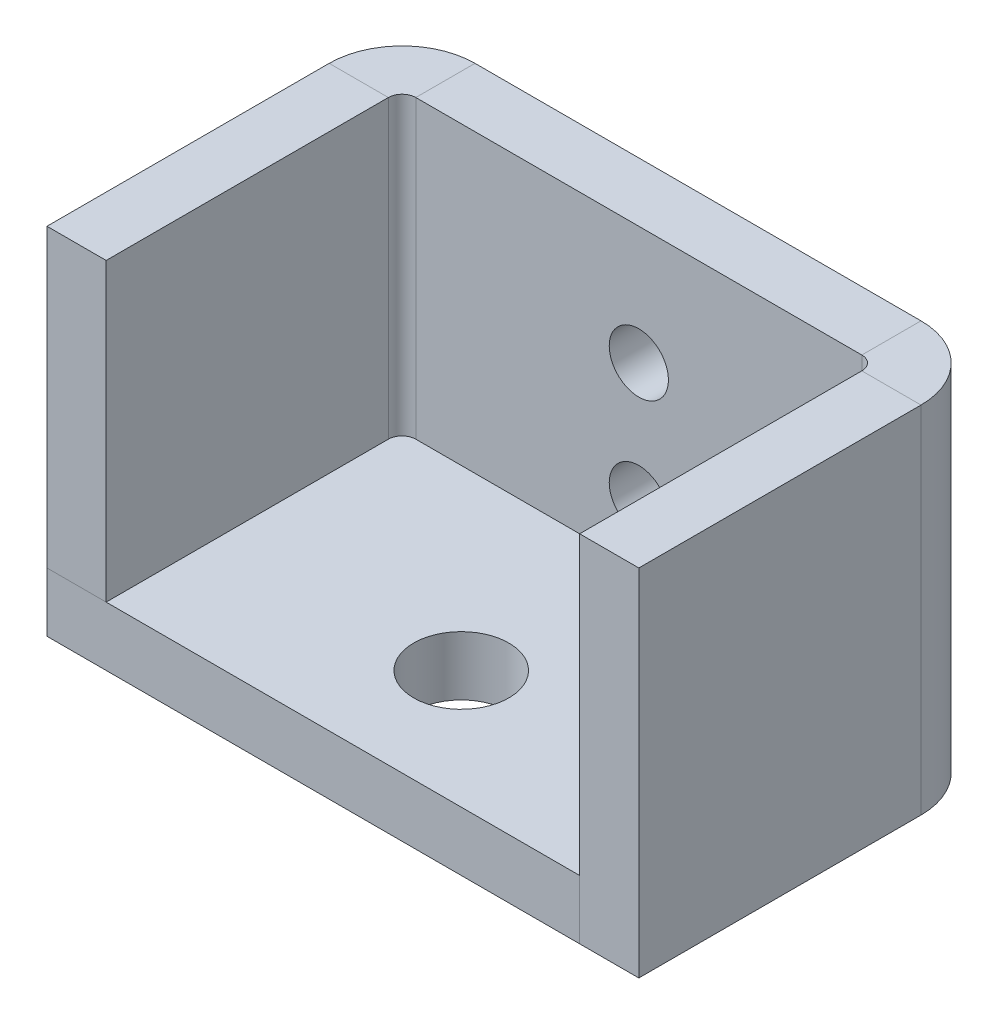
ISO-10303-21;
HEADER;
FILE_DESCRIPTION(('STEP AP214'),'2;1');
FILE_NAME('part.step','',(''),(''),'','','');
FILE_SCHEMA(('AUTOMOTIVE_DESIGN { 1 0 10303 214 1 1 1 1 }'));
ENDSEC;
DATA;
#1=APPLICATION_CONTEXT('core data for automotive mechanical design processes');
#2=APPLICATION_PROTOCOL_DEFINITION('international standard','automotive_design',2000,#1);
#3=PRODUCT_CONTEXT('',#1,'mechanical');
#4=PRODUCT('Part','Part','',(#3));
#5=PRODUCT_RELATED_PRODUCT_CATEGORY('part','',(#4));
#6=PRODUCT_DEFINITION_FORMATION('','',#4);
#7=PRODUCT_DEFINITION_CONTEXT('part definition',#1,'design');
#8=PRODUCT_DEFINITION('design','',#6,#7);
#9=PRODUCT_DEFINITION_SHAPE('','',#8);
#10=(LENGTH_UNIT() NAMED_UNIT(*) SI_UNIT(.MILLI.,.METRE.));
#11=(NAMED_UNIT(*) PLANE_ANGLE_UNIT() SI_UNIT($,.RADIAN.));
#12=(NAMED_UNIT(*) SI_UNIT($,.STERADIAN.) SOLID_ANGLE_UNIT());
#13=UNCERTAINTY_MEASURE_WITH_UNIT(LENGTH_MEASURE(1.E-05),#10,'distance_accuracy_value','');
#14=(GEOMETRIC_REPRESENTATION_CONTEXT(3) GLOBAL_UNCERTAINTY_ASSIGNED_CONTEXT((#13)) GLOBAL_UNIT_ASSIGNED_CONTEXT((#10,
#11,#12)) REPRESENTATION_CONTEXT('',''));
#15=CARTESIAN_POINT('',(0.,0.,0.));
#16=DIRECTION('',(0.,0.,1.));
#17=DIRECTION('',(1.,0.,0.));
#18=AXIS2_PLACEMENT_3D('',#15,#16,#17);
#19=CARTESIAN_POINT('',(-15.875,-6.35,15.875));
#20=DIRECTION('',(0.,0.,1.));
#21=DIRECTION('',(1.,0.,0.));
#22=AXIS2_PLACEMENT_3D('',#19,#20,#21);
#23=PLANE('',#22);
#24=DIRECTION('',(-1.,0.,0.));
#25=VECTOR('',#24,1.);
#26=CARTESIAN_POINT('',(-15.875,-9.525,15.875));
#27=LINE('',#26,#25);
#28=CARTESIAN_POINT('',(15.8750000000001,-9.525,15.875));
#29=VERTEX_POINT('',#28);
#30=CARTESIAN_POINT('',(-15.875,-9.525,15.875));
#31=VERTEX_POINT('',#30);
#32=EDGE_CURVE('E141',#29,#31,#27,.T.);
#33=ORIENTED_EDGE('',*,*,#32,.F.);
#34=DIRECTION('',(0.,-1.,0.));
#35=VECTOR('',#34,1.);
#36=CARTESIAN_POINT('',(15.8750000000001,-6.35,15.875));
#37=LINE('',#36,#35);
#38=CARTESIAN_POINT('',(15.8750000000001,-6.35,15.875));
#39=VERTEX_POINT('',#38);
#40=EDGE_CURVE('E12',#39,#29,#37,.T.);
#41=ORIENTED_EDGE('',*,*,#40,.F.);
#42=DIRECTION('',(-1.,0.,0.));
#43=VECTOR('',#42,1.);
#44=CARTESIAN_POINT('',(-15.875,-6.35,15.875));
#45=LINE('',#44,#43);
#46=CARTESIAN_POINT('',(-15.875,-6.35,15.875));
#47=VERTEX_POINT('',#46);
#48=EDGE_CURVE('E156',#39,#47,#45,.T.);
#49=ORIENTED_EDGE('',*,*,#48,.T.);
#50=DIRECTION('',(0.,-1.,0.));
#51=VECTOR('',#50,1.);
#52=CARTESIAN_POINT('',(-15.875,-6.35,15.875));
#53=LINE('',#52,#51);
#54=EDGE_CURVE('E59',#47,#31,#53,.T.);
#55=ORIENTED_EDGE('',*,*,#54,.T.);
#56=EDGE_LOOP('',(#33,#41,#49,#55));
#57=FACE_BOUND('',#56,.T.);
#58=ADVANCED_FACE('F56',(#57),#23,.T.);
#59=CARTESIAN_POINT('',(15.8750000000001,-6.35,15.875));
#60=DIRECTION('',(1.,0.,0.));
#61=DIRECTION('',(0.,0.,-1.));
#62=AXIS2_PLACEMENT_3D('',#59,#60,#61);
#63=PLANE('',#62);
#64=DIRECTION('',(0.,0.,1.));
#65=VECTOR('',#64,1.);
#66=CARTESIAN_POINT('',(15.8750000000001,-9.525,15.875));
#67=LINE('',#66,#65);
#68=CARTESIAN_POINT('',(15.875,-9.525,0.736599999999985));
#69=VERTEX_POINT('',#68);
#70=EDGE_CURVE('E154',#69,#29,#67,.T.);
#71=ORIENTED_EDGE('',*,*,#70,.F.);
#72=DIRECTION('',(0.,-1.,0.));
#73=VECTOR('',#72,1.);
#74=CARTESIAN_POINT('',(15.875,-6.35,0.736599999999985));
#75=LINE('',#74,#73);
#76=CARTESIAN_POINT('',(15.875,-6.35,0.736599999999985));
#77=VERTEX_POINT('',#76);
#78=EDGE_CURVE('E65',#77,#69,#75,.T.);
#79=ORIENTED_EDGE('',*,*,#78,.F.);
#80=DIRECTION('',(0.,0.,1.));
#81=VECTOR('',#80,1.);
#82=CARTESIAN_POINT('',(15.8750000000001,-6.35,15.875));
#83=LINE('',#82,#81);
#84=EDGE_CURVE('E131',#77,#39,#83,.T.);
#85=ORIENTED_EDGE('',*,*,#84,.T.);
#86=ORIENTED_EDGE('',*,*,#40,.T.);
#87=EDGE_LOOP('',(#71,#79,#85,#86));
#88=FACE_BOUND('',#87,.T.);
#89=ADVANCED_FACE('F164',(#88),#63,.T.);
#90=CARTESIAN_POINT('',(11.9634,-6.35,0.736599999999999));
#91=DIRECTION('',(0.,-1.,0.));
#92=DIRECTION('',(0.,0.,-1.));
#93=AXIS2_PLACEMENT_3D('',#90,#91,#92);
#94=CYLINDRICAL_SURFACE('',#93,3.9116);
#95=CARTESIAN_POINT('',(11.9634,-9.525,0.736599999999999));
#96=DIRECTION('',(0.,-1.,0.));
#97=DIRECTION('',(0.,0.,1.));
#98=AXIS2_PLACEMENT_3D('',#95,#96,#97);
#99=CIRCLE('',#98,3.9116);
#100=CARTESIAN_POINT('',(11.9634000000001,-9.525,-3.175));
#101=VERTEX_POINT('',#100);
#102=EDGE_CURVE('E118',#101,#69,#99,.T.);
#103=ORIENTED_EDGE('',*,*,#102,.F.);
#104=DIRECTION('',(0.,-1.,0.));
#105=VECTOR('',#104,1.);
#106=CARTESIAN_POINT('',(11.9634000000001,-6.35,-3.175));
#107=LINE('',#106,#105);
#108=CARTESIAN_POINT('',(11.9634000000001,-6.35,-3.175));
#109=VERTEX_POINT('',#108);
#110=EDGE_CURVE('E113',#109,#101,#107,.T.);
#111=ORIENTED_EDGE('',*,*,#110,.F.);
#112=CARTESIAN_POINT('',(11.9634,-6.35,0.736599999999999));
#113=DIRECTION('',(0.,-1.,0.));
#114=DIRECTION('',(0.,0.,1.));
#115=AXIS2_PLACEMENT_3D('',#112,#113,#114);
#116=CIRCLE('',#115,3.9116);
#117=EDGE_CURVE('E116',#109,#77,#116,.T.);
#118=ORIENTED_EDGE('',*,*,#117,.T.);
#119=ORIENTED_EDGE('',*,*,#78,.T.);
#120=EDGE_LOOP('',(#103,#111,#118,#119));
#121=FACE_BOUND('',#120,.T.);
#122=ADVANCED_FACE('F115',(#121),#94,.T.);
#123=CARTESIAN_POINT('',(-11.9634,-6.35,-3.17500000000001));
#124=DIRECTION('',(0.,0.,-1.));
#125=DIRECTION('',(-1.,0.,0.));
#126=AXIS2_PLACEMENT_3D('',#123,#124,#125);
#127=PLANE('',#126);
#128=DIRECTION('',(1.,0.,0.));
#129=VECTOR('',#128,1.);
#130=CARTESIAN_POINT('',(-11.9634,-9.525,-3.17500000000001));
#131=LINE('',#130,#129);
#132=CARTESIAN_POINT('',(-11.9634,-9.525,-3.17500000000001));
#133=VERTEX_POINT('',#132);
#134=EDGE_CURVE('E151',#133,#101,#131,.T.);
#135=ORIENTED_EDGE('',*,*,#134,.F.);
#136=DIRECTION('',(0.,-1.,0.));
#137=VECTOR('',#136,1.);
#138=CARTESIAN_POINT('',(-11.9634,-6.35,-3.17500000000001));
#139=LINE('',#138,#137);
#140=CARTESIAN_POINT('',(-11.9634,-6.35,-3.17500000000001));
#141=VERTEX_POINT('',#140);
#142=EDGE_CURVE('E123',#141,#133,#139,.T.);
#143=ORIENTED_EDGE('',*,*,#142,.F.);
#144=DIRECTION('',(1.,0.,0.));
#145=VECTOR('',#144,1.);
#146=CARTESIAN_POINT('',(-11.9634,-6.35,-3.17500000000001));
#147=LINE('',#146,#145);
#148=EDGE_CURVE('E129',#141,#109,#147,.T.);
#149=ORIENTED_EDGE('',*,*,#148,.T.);
#150=ORIENTED_EDGE('',*,*,#110,.T.);
#151=EDGE_LOOP('',(#135,#143,#149,#150));
#152=FACE_BOUND('',#151,.T.);
#153=ADVANCED_FACE('F133',(#152),#127,.T.);
#154=CARTESIAN_POINT('',(-11.9634,-6.35,0.736599999999982));
#155=DIRECTION('',(0.,-1.,0.));
#156=DIRECTION('',(0.,0.,-1.));
#157=AXIS2_PLACEMENT_3D('',#154,#155,#156);
#158=CYLINDRICAL_SURFACE('',#157,3.91159999999999);
#159=CARTESIAN_POINT('',(-11.9634,-9.525,0.736599999999982));
#160=DIRECTION('',(0.,-1.,0.));
#161=DIRECTION('',(0.,0.,-1.));
#162=AXIS2_PLACEMENT_3D('',#159,#160,#161);
#163=CIRCLE('',#162,3.91159999999999);
#164=CARTESIAN_POINT('',(-15.875,-9.525,0.736599999999972));
#165=VERTEX_POINT('',#164);
#166=EDGE_CURVE('E148',#165,#133,#163,.T.);
#167=ORIENTED_EDGE('',*,*,#166,.F.);
#168=DIRECTION('',(0.,-1.,0.));
#169=VECTOR('',#168,1.);
#170=CARTESIAN_POINT('',(-15.875,-6.35,0.736599999999972));
#171=LINE('',#170,#169);
#172=CARTESIAN_POINT('',(-15.875,-6.35,0.736599999999972));
#173=VERTEX_POINT('',#172);
#174=EDGE_CURVE('E159',#173,#165,#171,.T.);
#175=ORIENTED_EDGE('',*,*,#174,.F.);
#176=CARTESIAN_POINT('',(-11.9634,-6.35,0.736599999999982));
#177=DIRECTION('',(0.,-1.,0.));
#178=DIRECTION('',(0.,0.,-1.));
#179=AXIS2_PLACEMENT_3D('',#176,#177,#178);
#180=CIRCLE('',#179,3.91159999999999);
#181=EDGE_CURVE('E134',#173,#141,#180,.T.);
#182=ORIENTED_EDGE('',*,*,#181,.T.);
#183=ORIENTED_EDGE('',*,*,#142,.T.);
#184=EDGE_LOOP('',(#167,#175,#182,#183));
#185=FACE_BOUND('',#184,.T.);
#186=ADVANCED_FACE('F177',(#185),#158,.T.);
#187=CARTESIAN_POINT('',(-15.875,-6.35,15.875));
#188=DIRECTION('',(-1.,0.,0.));
#189=DIRECTION('',(0.,0.,1.));
#190=AXIS2_PLACEMENT_3D('',#187,#188,#189);
#191=PLANE('',#190);
#192=DIRECTION('',(0.,0.,-1.));
#193=VECTOR('',#192,1.);
#194=CARTESIAN_POINT('',(-15.875,-9.525,15.875));
#195=LINE('',#194,#193);
#196=EDGE_CURVE('E144',#31,#165,#195,.T.);
#197=ORIENTED_EDGE('',*,*,#196,.F.);
#198=ORIENTED_EDGE('',*,*,#54,.F.);
#199=DIRECTION('',(0.,0.,-1.));
#200=VECTOR('',#199,1.);
#201=CARTESIAN_POINT('',(-15.875,-6.35,15.875));
#202=LINE('',#201,#200);
#203=EDGE_CURVE('E136',#47,#173,#202,.T.);
#204=ORIENTED_EDGE('',*,*,#203,.T.);
#205=ORIENTED_EDGE('',*,*,#174,.T.);
#206=EDGE_LOOP('',(#197,#198,#204,#205));
#207=FACE_BOUND('',#206,.T.);
#208=ADVANCED_FACE('F161',(#207),#191,.T.);
#209=CARTESIAN_POINT('',(11.9634,-6.35,0.736599999999999));
#210=DIRECTION('',(0.,1.,0.));
#211=DIRECTION('',(0.,0.,1.));
#212=AXIS2_PLACEMENT_3D('',#209,#210,#211);
#213=PLANE('',#212);
#214=CARTESIAN_POINT('',(0.,-6.35,9.525));
#215=DIRECTION('',(0.,1.,0.));
#216=DIRECTION('',(0.,0.,1.));
#217=AXIS2_PLACEMENT_3D('',#214,#215,#216);
#218=CIRCLE('',#217,2.5527);
#219=CARTESIAN_POINT('',(0.,-6.35,12.0777));
#220=VERTEX_POINT('',#219);
#221=EDGE_CURVE('E200',#220,#220,#218,.T.);
#222=ORIENTED_EDGE('',*,*,#221,.F.);
#223=EDGE_LOOP('',(#222));
#224=FACE_BOUND('',#223,.T.);
#225=ORIENTED_EDGE('',*,*,#48,.F.);
#226=ORIENTED_EDGE('',*,*,#84,.F.);
#227=ORIENTED_EDGE('',*,*,#117,.F.);
#228=ORIENTED_EDGE('',*,*,#148,.F.);
#229=ORIENTED_EDGE('',*,*,#181,.F.);
#230=ORIENTED_EDGE('',*,*,#203,.F.);
#231=EDGE_LOOP('',(#225,#226,#227,#228,#229,#230));
#232=FACE_BOUND('',#231,.T.);
#233=ADVANCED_FACE('F127',(#224,#232),#213,.T.);
#234=CARTESIAN_POINT('',(11.9634,-9.525,0.736599999999999));
#235=DIRECTION('',(0.,1.,0.));
#236=DIRECTION('',(0.,0.,1.));
#237=AXIS2_PLACEMENT_3D('',#234,#235,#236);
#238=PLANE('',#237);
#239=CARTESIAN_POINT('',(0.,-9.52499999999999,9.525));
#240=DIRECTION('',(0.,1.,0.));
#241=DIRECTION('',(0.,0.,1.));
#242=AXIS2_PLACEMENT_3D('',#239,#240,#241);
#243=CIRCLE('',#242,2.5527);
#244=CARTESIAN_POINT('',(0.,-9.52499999999999,12.0777));
#245=VERTEX_POINT('',#244);
#246=EDGE_CURVE('E145',#245,#245,#243,.T.);
#247=ORIENTED_EDGE('',*,*,#246,.T.);
#248=EDGE_LOOP('',(#247));
#249=FACE_BOUND('',#248,.T.);
#250=ORIENTED_EDGE('',*,*,#32,.T.);
#251=ORIENTED_EDGE('',*,*,#196,.T.);
#252=ORIENTED_EDGE('',*,*,#166,.T.);
#253=ORIENTED_EDGE('',*,*,#134,.T.);
#254=ORIENTED_EDGE('',*,*,#102,.T.);
#255=ORIENTED_EDGE('',*,*,#70,.T.);
#256=EDGE_LOOP('',(#250,#251,#252,#253,#254,#255));
#257=FACE_BOUND('',#256,.T.);
#258=ADVANCED_FACE('F163',(#249,#257),#238,.F.);
#259=CARTESIAN_POINT('',(0.,-6.35,9.525));
#260=DIRECTION('',(0.,1.,0.));
#261=DIRECTION('',(0.,0.,1.));
#262=AXIS2_PLACEMENT_3D('',#259,#260,#261);
#263=CYLINDRICAL_SURFACE('',#262,2.5527);
#264=ORIENTED_EDGE('',*,*,#246,.F.);
#265=EDGE_LOOP('',(#264));
#266=FACE_BOUND('',#265,.T.);
#267=ORIENTED_EDGE('',*,*,#221,.T.);
#268=EDGE_LOOP('',(#267));
#269=FACE_BOUND('',#268,.T.);
#270=ADVANCED_FACE('F188',(#266,#269),#263,.F.);
#271=CLOSED_SHELL('',(#58,#89,#122,#153,#186,#208,#233,#258,#270));
#272=MANIFOLD_SOLID_BREP('B2',#271);
#273=CARTESIAN_POINT('',(-12.7,-9.525,-3.175));
#274=DIRECTION('',(0.,-1.,0.));
#275=DIRECTION('',(0.,0.,-1.));
#276=AXIS2_PLACEMENT_3D('',#273,#274,#275);
#277=PLANE('',#276);
#278=DIRECTION('',(0.,0.,-1.));
#279=VECTOR('',#278,1.);
#280=CARTESIAN_POINT('',(-1.5875,-9.525,15.875));
#281=LINE('',#280,#279);
#282=CARTESIAN_POINT('',(-1.5875,-9.525,0.));
#283=VERTEX_POINT('',#282);
#284=CARTESIAN_POINT('',(-1.5875,-9.525,-3.175));
#285=VERTEX_POINT('',#284);
#286=EDGE_CURVE('E54',#283,#285,#281,.T.);
#287=ORIENTED_EDGE('',*,*,#286,.F.);
#288=DIRECTION('',(1.,0.,0.));
#289=VECTOR('',#288,1.);
#290=CARTESIAN_POINT('',(-12.7,-9.525,0.));
#291=LINE('',#290,#289);
#292=CARTESIAN_POINT('',(-11.9634,-9.525,0.));
#293=VERTEX_POINT('',#292);
#294=EDGE_CURVE('E404',#293,#283,#291,.T.);
#295=ORIENTED_EDGE('',*,*,#294,.F.);
#296=DIRECTION('',(0.,0.,-1.));
#297=VECTOR('',#296,1.);
#298=CARTESIAN_POINT('',(-11.9634,-9.525,0.));
#299=LINE('',#298,#297);
#300=CARTESIAN_POINT('',(-11.9634,-9.525,-3.175));
#301=VERTEX_POINT('',#300);
#302=EDGE_CURVE('E388',#293,#301,#299,.T.);
#303=ORIENTED_EDGE('',*,*,#302,.T.);
#304=DIRECTION('',(1.,0.,0.));
#305=VECTOR('',#304,1.);
#306=CARTESIAN_POINT('',(-12.7,-9.525,-3.175));
#307=LINE('',#306,#305);
#308=EDGE_CURVE('E380',#301,#285,#307,.T.);
#309=ORIENTED_EDGE('',*,*,#308,.T.);
#310=EDGE_LOOP('',(#287,#295,#303,#309));
#311=FACE_BOUND('',#310,.T.);
#312=ADVANCED_FACE('F268',(#311),#277,.T.);
#313=CARTESIAN_POINT('',(0.,0.,-3.175));
#314=DIRECTION('',(0.,0.,1.));
#315=DIRECTION('',(1.,0.,0.));
#316=AXIS2_PLACEMENT_3D('',#313,#314,#315);
#317=PLANE('',#316);
#318=CARTESIAN_POINT('',(0.,3.17500000000002,-3.175));
#319=DIRECTION('',(0.,0.,-1.));
#320=DIRECTION('',(-1.,0.,0.));
#321=AXIS2_PLACEMENT_3D('',#318,#319,#320);
#322=CIRCLE('',#321,1.5875);
#323=CARTESIAN_POINT('',(-1.5875,3.17500000000002,-3.175));
#324=VERTEX_POINT('',#323);
#325=EDGE_CURVE('E415',#324,#324,#322,.T.);
#326=ORIENTED_EDGE('',*,*,#325,.F.);
#327=EDGE_LOOP('',(#326));
#328=FACE_BOUND('',#327,.T.);
#329=CARTESIAN_POINT('',(0.,-3.17500000000001,-3.175));
#330=DIRECTION('',(0.,0.,-1.));
#331=DIRECTION('',(-1.,0.,0.));
#332=AXIS2_PLACEMENT_3D('',#329,#330,#331);
#333=CIRCLE('',#332,1.5875);
#334=CARTESIAN_POINT('',(-1.5875,-3.17500000000001,-3.175));
#335=VERTEX_POINT('',#334);
#336=EDGE_CURVE('E385',#335,#335,#333,.T.);
#337=ORIENTED_EDGE('',*,*,#336,.F.);
#338=EDGE_LOOP('',(#337));
#339=FACE_BOUND('',#338,.T.);
#340=CARTESIAN_POINT('',(1.5875,-9.525,-3.175));
#341=VERTEX_POINT('',#340);
#342=CARTESIAN_POINT('',(11.9634,-9.52499999999997,-3.175));
#343=VERTEX_POINT('',#342);
#344=EDGE_CURVE('E383',#341,#343,#307,.T.);
#345=ORIENTED_EDGE('',*,*,#344,.F.);
#346=CARTESIAN_POINT('',(0.,-9.52500000000004,-3.175));
#347=DIRECTION('',(0.,0.,-1.));
#348=DIRECTION('',(-1.,0.,0.));
#349=AXIS2_PLACEMENT_3D('',#346,#347,#348);
#350=CIRCLE('',#349,1.5875);
#351=EDGE_CURVE('E285',#285,#341,#350,.T.);
#352=ORIENTED_EDGE('',*,*,#351,.F.);
#353=ORIENTED_EDGE('',*,*,#308,.F.);
#354=DIRECTION('',(0.,-1.,0.));
#355=VECTOR('',#354,1.);
#356=CARTESIAN_POINT('',(-11.9634,-9.525,-3.175));
#357=LINE('',#356,#355);
#358=CARTESIAN_POINT('',(-11.9634,9.52500000000002,-3.175));
#359=VERTEX_POINT('',#358);
#360=EDGE_CURVE('E464',#301,#359,#357,.F.);
#361=ORIENTED_EDGE('',*,*,#360,.T.);
#362=DIRECTION('',(-1.,0.,0.));
#363=VECTOR('',#362,1.);
#364=CARTESIAN_POINT('',(12.7,9.525,-3.175));
#365=LINE('',#364,#363);
#366=CARTESIAN_POINT('',(11.9634,9.525,-3.175));
#367=VERTEX_POINT('',#366);
#368=EDGE_CURVE('E395',#367,#359,#365,.T.);
#369=ORIENTED_EDGE('',*,*,#368,.F.);
#370=DIRECTION('',(0.,1.,0.));
#371=VECTOR('',#370,1.);
#372=CARTESIAN_POINT('',(11.9634,9.525,-3.175));
#373=LINE('',#372,#371);
#374=EDGE_CURVE('E535',#367,#343,#373,.F.);
#375=ORIENTED_EDGE('',*,*,#374,.T.);
#376=EDGE_LOOP('',(#345,#352,#353,#361,#369,#375));
#377=FACE_BOUND('',#376,.T.);
#378=ADVANCED_FACE('F379',(#328,#339,#377),#317,.F.);
#379=CARTESIAN_POINT('',(0.,0.,0.));
#380=DIRECTION('',(0.,0.,1.));
#381=DIRECTION('',(1.,0.,0.));
#382=AXIS2_PLACEMENT_3D('',#379,#380,#381);
#383=PLANE('',#382);
#384=CARTESIAN_POINT('',(0.,3.17500000000002,0.));
#385=DIRECTION('',(0.,0.,1.));
#386=DIRECTION('',(1.,0.,0.));
#387=AXIS2_PLACEMENT_3D('',#384,#385,#386);
#388=CIRCLE('',#387,1.5875);
#389=CARTESIAN_POINT('',(1.58749999999999,3.17500000000002,0.));
#390=VERTEX_POINT('',#389);
#391=EDGE_CURVE('E272',#390,#390,#388,.T.);
#392=ORIENTED_EDGE('',*,*,#391,.F.);
#393=EDGE_LOOP('',(#392));
#394=FACE_BOUND('',#393,.T.);
#395=CARTESIAN_POINT('',(0.,-3.17500000000001,0.));
#396=DIRECTION('',(0.,0.,1.));
#397=DIRECTION('',(1.,0.,0.));
#398=AXIS2_PLACEMENT_3D('',#395,#396,#397);
#399=CIRCLE('',#398,1.5875);
#400=CARTESIAN_POINT('',(1.5875,-3.17500000000001,0.));
#401=VERTEX_POINT('',#400);
#402=EDGE_CURVE('E406',#401,#401,#399,.T.);
#403=ORIENTED_EDGE('',*,*,#402,.F.);
#404=EDGE_LOOP('',(#403));
#405=FACE_BOUND('',#404,.T.);
#406=CARTESIAN_POINT('',(0.,-9.52500000000004,0.));
#407=DIRECTION('',(0.,0.,1.));
#408=DIRECTION('',(1.,0.,0.));
#409=AXIS2_PLACEMENT_3D('',#406,#407,#408);
#410=CIRCLE('',#409,1.5875);
#411=CARTESIAN_POINT('',(1.58749999999999,-9.525,0.));
#412=VERTEX_POINT('',#411);
#413=EDGE_CURVE('E372',#412,#283,#410,.T.);
#414=ORIENTED_EDGE('',*,*,#413,.F.);
#415=CARTESIAN_POINT('',(11.9634,-9.525,0.));
#416=VERTEX_POINT('',#415);
#417=EDGE_CURVE('E402',#412,#416,#291,.T.);
#418=ORIENTED_EDGE('',*,*,#417,.T.);
#419=DIRECTION('',(0.,1.,0.));
#420=VECTOR('',#419,1.);
#421=CARTESIAN_POINT('',(11.9634,9.525,0.));
#422=LINE('',#421,#420);
#423=CARTESIAN_POINT('',(11.9634,9.525,0.));
#424=VERTEX_POINT('',#423);
#425=EDGE_CURVE('E293',#424,#416,#422,.F.);
#426=ORIENTED_EDGE('',*,*,#425,.F.);
#427=DIRECTION('',(-1.,0.,0.));
#428=VECTOR('',#427,1.);
#429=CARTESIAN_POINT('',(12.7,9.525,0.));
#430=LINE('',#429,#428);
#431=CARTESIAN_POINT('',(-11.9634,9.525,0.));
#432=VERTEX_POINT('',#431);
#433=EDGE_CURVE('E399',#424,#432,#430,.T.);
#434=ORIENTED_EDGE('',*,*,#433,.T.);
#435=DIRECTION('',(0.,-1.,0.));
#436=VECTOR('',#435,1.);
#437=CARTESIAN_POINT('',(-11.9634,-9.525,0.));
#438=LINE('',#437,#436);
#439=EDGE_CURVE('E479',#293,#432,#438,.F.);
#440=ORIENTED_EDGE('',*,*,#439,.F.);
#441=ORIENTED_EDGE('',*,*,#294,.T.);
#442=EDGE_LOOP('',(#414,#418,#426,#434,#440,#441));
#443=FACE_BOUND('',#442,.T.);
#444=ADVANCED_FACE('F612',(#394,#405,#443),#383,.T.);
#445=DIRECTION('',(0.,0.,-1.));
#446=VECTOR('',#445,1.);
#447=CARTESIAN_POINT('',(1.58749999999999,-9.525,15.875));
#448=LINE('',#447,#446);
#449=EDGE_CURVE('E278',#341,#412,#448,.F.);
#450=ORIENTED_EDGE('',*,*,#449,.F.);
#451=ORIENTED_EDGE('',*,*,#344,.T.);
#452=DIRECTION('',(0.,0.,-1.));
#453=VECTOR('',#452,1.);
#454=CARTESIAN_POINT('',(11.9634,-9.525,0.));
#455=LINE('',#454,#453);
#456=EDGE_CURVE('E403',#416,#343,#455,.T.);
#457=ORIENTED_EDGE('',*,*,#456,.F.);
#458=ORIENTED_EDGE('',*,*,#417,.F.);
#459=EDGE_LOOP('',(#450,#451,#457,#458));
#460=FACE_BOUND('',#459,.T.);
#461=ADVANCED_FACE('F607',(#460),#277,.T.);
#462=CARTESIAN_POINT('',(12.7,9.525,-3.175));
#463=DIRECTION('',(0.,1.,0.));
#464=DIRECTION('',(-1.,0.,0.));
#465=AXIS2_PLACEMENT_3D('',#462,#463,#464);
#466=PLANE('',#465);
#467=DIRECTION('',(0.,0.,-1.));
#468=VECTOR('',#467,1.);
#469=CARTESIAN_POINT('',(-11.9634,9.525,0.));
#470=LINE('',#469,#468);
#471=EDGE_CURVE('E486',#432,#359,#470,.T.);
#472=ORIENTED_EDGE('',*,*,#471,.F.);
#473=ORIENTED_EDGE('',*,*,#433,.F.);
#474=DIRECTION('',(0.,0.,-1.));
#475=VECTOR('',#474,1.);
#476=CARTESIAN_POINT('',(11.9634,9.525,0.));
#477=LINE('',#476,#475);
#478=EDGE_CURVE('E543',#424,#367,#477,.T.);
#479=ORIENTED_EDGE('',*,*,#478,.T.);
#480=ORIENTED_EDGE('',*,*,#368,.T.);
#481=EDGE_LOOP('',(#472,#473,#479,#480));
#482=FACE_BOUND('',#481,.T.);
#483=ADVANCED_FACE('F270',(#482),#466,.T.);
#484=CARTESIAN_POINT('',(11.9634,-9.525,0.7366));
#485=DIRECTION('',(0.,-1.,0.));
#486=DIRECTION('',(0.,0.,-1.));
#487=AXIS2_PLACEMENT_3D('',#484,#485,#486);
#488=PLANE('',#487);
#489=DIRECTION('',(1.,0.,0.));
#490=VECTOR('',#489,1.);
#491=CARTESIAN_POINT('',(12.7,-9.525,0.736599999999997));
#492=LINE('',#491,#490);
#493=CARTESIAN_POINT('',(12.7,-9.525,0.736599999999997));
#494=VERTEX_POINT('',#493);
#495=CARTESIAN_POINT('',(15.875,-9.525,0.736599999999986));
#496=VERTEX_POINT('',#495);
#497=EDGE_CURVE('E490',#494,#496,#492,.T.);
#498=ORIENTED_EDGE('',*,*,#497,.F.);
#499=CARTESIAN_POINT('',(11.9634,-9.525,0.7366));
#500=DIRECTION('',(0.,1.,0.));
#501=DIRECTION('',(0.,0.,1.));
#502=AXIS2_PLACEMENT_3D('',#499,#500,#501);
#503=CIRCLE('',#502,0.736599999999999);
#504=EDGE_CURVE('E547',#416,#494,#503,.F.);
#505=ORIENTED_EDGE('',*,*,#504,.F.);
#506=ORIENTED_EDGE('',*,*,#456,.T.);
#507=CARTESIAN_POINT('',(11.9634,-9.525,0.7366));
#508=DIRECTION('',(0.,1.,0.));
#509=DIRECTION('',(0.,0.,1.));
#510=AXIS2_PLACEMENT_3D('',#507,#508,#509);
#511=CIRCLE('',#510,3.9116);
#512=EDGE_CURVE('E538',#343,#496,#511,.F.);
#513=ORIENTED_EDGE('',*,*,#512,.T.);
#514=EDGE_LOOP('',(#498,#505,#506,#513));
#515=FACE_BOUND('',#514,.T.);
#516=ADVANCED_FACE('F590',(#515),#488,.T.);
#517=CARTESIAN_POINT('',(11.9634,9.525,0.7366));
#518=DIRECTION('',(0.,-1.,0.));
#519=DIRECTION('',(0.,0.,-1.));
#520=AXIS2_PLACEMENT_3D('',#517,#518,#519);
#521=PLANE('',#520);
#522=CARTESIAN_POINT('',(11.9634,9.525,0.7366));
#523=DIRECTION('',(0.,1.,0.));
#524=DIRECTION('',(0.,0.,1.));
#525=AXIS2_PLACEMENT_3D('',#522,#523,#524);
#526=CIRCLE('',#525,0.736599999999999);
#527=CARTESIAN_POINT('',(12.7,9.525,0.736599999999997));
#528=VERTEX_POINT('',#527);
#529=EDGE_CURVE('E534',#528,#424,#526,.T.);
#530=ORIENTED_EDGE('',*,*,#529,.F.);
#531=DIRECTION('',(1.,0.,0.));
#532=VECTOR('',#531,1.);
#533=CARTESIAN_POINT('',(12.7,9.525,0.736599999999997));
#534=LINE('',#533,#532);
#535=CARTESIAN_POINT('',(15.875,9.525,0.736599999999986));
#536=VERTEX_POINT('',#535);
#537=EDGE_CURVE('E496',#528,#536,#534,.T.);
#538=ORIENTED_EDGE('',*,*,#537,.T.);
#539=CARTESIAN_POINT('',(11.9634,9.525,0.7366));
#540=DIRECTION('',(0.,1.,0.));
#541=DIRECTION('',(0.,0.,1.));
#542=AXIS2_PLACEMENT_3D('',#539,#540,#541);
#543=CIRCLE('',#542,3.9116);
#544=EDGE_CURVE('E539',#536,#367,#543,.T.);
#545=ORIENTED_EDGE('',*,*,#544,.T.);
#546=ORIENTED_EDGE('',*,*,#478,.F.);
#547=EDGE_LOOP('',(#530,#538,#545,#546));
#548=FACE_BOUND('',#547,.T.);
#549=ADVANCED_FACE('F569',(#548),#521,.F.);
#550=CARTESIAN_POINT('',(11.9634,9.525,0.7366));
#551=DIRECTION('',(0.,1.,0.));
#552=DIRECTION('',(1.,0.,0.));
#553=AXIS2_PLACEMENT_3D('',#550,#551,#552);
#554=CYLINDRICAL_SURFACE('',#553,3.9116);
#555=ORIENTED_EDGE('',*,*,#374,.F.);
#556=ORIENTED_EDGE('',*,*,#544,.F.);
#557=DIRECTION('',(0.,-1.,0.));
#558=VECTOR('',#557,1.);
#559=CARTESIAN_POINT('',(15.875,0.,0.736599999999986));
#560=LINE('',#559,#558);
#561=EDGE_CURVE('E500',#536,#496,#560,.T.);
#562=ORIENTED_EDGE('',*,*,#561,.T.);
#563=ORIENTED_EDGE('',*,*,#512,.F.);
#564=EDGE_LOOP('',(#555,#556,#562,#563));
#565=FACE_BOUND('',#564,.T.);
#566=ADVANCED_FACE('F568',(#565),#554,.T.);
#567=CARTESIAN_POINT('',(11.9634,9.525,0.7366));
#568=DIRECTION('',(0.,1.,0.));
#569=DIRECTION('',(1.,0.,0.));
#570=AXIS2_PLACEMENT_3D('',#567,#568,#569);
#571=CYLINDRICAL_SURFACE('',#570,0.736599999999999);
#572=ORIENTED_EDGE('',*,*,#425,.T.);
#573=ORIENTED_EDGE('',*,*,#504,.T.);
#574=DIRECTION('',(0.,1.,0.));
#575=VECTOR('',#574,1.);
#576=CARTESIAN_POINT('',(12.7,-9.525,0.736599999999997));
#577=LINE('',#576,#575);
#578=EDGE_CURVE('E493',#494,#528,#577,.T.);
#579=ORIENTED_EDGE('',*,*,#578,.T.);
#580=ORIENTED_EDGE('',*,*,#529,.T.);
#581=EDGE_LOOP('',(#572,#573,#579,#580));
#582=FACE_BOUND('',#581,.T.);
#583=ADVANCED_FACE('F593',(#582),#571,.F.);
#584=CARTESIAN_POINT('',(15.8750000000001,9.525,15.875));
#585=DIRECTION('',(0.,-1.,0.));
#586=DIRECTION('',(0.,0.,-1.));
#587=AXIS2_PLACEMENT_3D('',#584,#585,#586);
#588=PLANE('',#587);
#589=ORIENTED_EDGE('',*,*,#537,.F.);
#590=DIRECTION('',(0.,0.,1.));
#591=VECTOR('',#590,1.);
#592=CARTESIAN_POINT('',(12.7000000000001,9.525,15.875));
#593=LINE('',#592,#591);
#594=CARTESIAN_POINT('',(12.7000000000001,9.525,15.875));
#595=VERTEX_POINT('',#594);
#596=EDGE_CURVE('E506',#528,#595,#593,.T.);
#597=ORIENTED_EDGE('',*,*,#596,.T.);
#598=DIRECTION('',(-1.,0.,0.));
#599=VECTOR('',#598,1.);
#600=CARTESIAN_POINT('',(15.8750000000001,9.525,15.875));
#601=LINE('',#600,#599);
#602=CARTESIAN_POINT('',(15.8750000000001,9.525,15.875));
#603=VERTEX_POINT('',#602);
#604=EDGE_CURVE('E530',#603,#595,#601,.T.);
#605=ORIENTED_EDGE('',*,*,#604,.F.);
#606=DIRECTION('',(0.,0.,1.));
#607=VECTOR('',#606,1.);
#608=CARTESIAN_POINT('',(15.8750000000001,9.525,15.875));
#609=LINE('',#608,#607);
#610=EDGE_CURVE('E507',#536,#603,#609,.T.);
#611=ORIENTED_EDGE('',*,*,#610,.F.);
#612=EDGE_LOOP('',(#589,#597,#605,#611));
#613=FACE_BOUND('',#612,.T.);
#614=ADVANCED_FACE('F579',(#613),#588,.F.);
#615=CARTESIAN_POINT('',(15.875,-9.525,0.));
#616=DIRECTION('',(0.,1.,0.));
#617=DIRECTION('',(0.,0.,1.));
#618=AXIS2_PLACEMENT_3D('',#615,#616,#617);
#619=PLANE('',#618);
#620=ORIENTED_EDGE('',*,*,#497,.T.);
#621=DIRECTION('',(0.,0.,-1.));
#622=VECTOR('',#621,1.);
#623=CARTESIAN_POINT('',(15.875,-9.525,0.));
#624=LINE('',#623,#622);
#625=CARTESIAN_POINT('',(15.8750000000001,-9.525,15.875));
#626=VERTEX_POINT('',#625);
#627=EDGE_CURVE('E514',#626,#496,#624,.T.);
#628=ORIENTED_EDGE('',*,*,#627,.F.);
#629=DIRECTION('',(-1.,0.,0.));
#630=VECTOR('',#629,1.);
#631=CARTESIAN_POINT('',(15.8750000000001,-9.525,15.875));
#632=LINE('',#631,#630);
#633=CARTESIAN_POINT('',(12.7000000000001,-9.525,15.875));
#634=VERTEX_POINT('',#633);
#635=EDGE_CURVE('E518',#626,#634,#632,.T.);
#636=ORIENTED_EDGE('',*,*,#635,.T.);
#637=DIRECTION('',(0.,0.,-1.));
#638=VECTOR('',#637,1.);
#639=CARTESIAN_POINT('',(12.7,-9.525,0.));
#640=LINE('',#639,#638);
#641=EDGE_CURVE('E511',#634,#494,#640,.T.);
#642=ORIENTED_EDGE('',*,*,#641,.T.);
#643=EDGE_LOOP('',(#620,#628,#636,#642));
#644=FACE_BOUND('',#643,.T.);
#645=ADVANCED_FACE('F587',(#644),#619,.F.);
#646=CARTESIAN_POINT('',(15.875,0.,0.));
#647=DIRECTION('',(-1.,0.,0.));
#648=DIRECTION('',(0.,0.,1.));
#649=AXIS2_PLACEMENT_3D('',#646,#647,#648);
#650=PLANE('',#649);
#651=ORIENTED_EDGE('',*,*,#561,.F.);
#652=ORIENTED_EDGE('',*,*,#610,.T.);
#653=DIRECTION('',(0.,-1.,0.));
#654=VECTOR('',#653,1.);
#655=CARTESIAN_POINT('',(15.8750000000001,-9.525,15.875));
#656=LINE('',#655,#654);
#657=EDGE_CURVE('E510',#603,#626,#656,.T.);
#658=ORIENTED_EDGE('',*,*,#657,.T.);
#659=ORIENTED_EDGE('',*,*,#627,.T.);
#660=EDGE_LOOP('',(#651,#652,#658,#659));
#661=FACE_BOUND('',#660,.T.);
#662=ADVANCED_FACE('F576',(#661),#650,.F.);
#663=CARTESIAN_POINT('',(12.7,0.,0.));
#664=DIRECTION('',(-1.,0.,0.));
#665=DIRECTION('',(0.,0.,1.));
#666=AXIS2_PLACEMENT_3D('',#663,#664,#665);
#667=PLANE('',#666);
#668=ORIENTED_EDGE('',*,*,#596,.F.);
#669=ORIENTED_EDGE('',*,*,#578,.F.);
#670=ORIENTED_EDGE('',*,*,#641,.F.);
#671=DIRECTION('',(0.,-1.,0.));
#672=VECTOR('',#671,1.);
#673=CARTESIAN_POINT('',(12.7000000000001,-9.525,15.875));
#674=LINE('',#673,#672);
#675=EDGE_CURVE('E521',#595,#634,#674,.T.);
#676=ORIENTED_EDGE('',*,*,#675,.F.);
#677=EDGE_LOOP('',(#668,#669,#670,#676));
#678=FACE_BOUND('',#677,.T.);
#679=ADVANCED_FACE('F595',(#678),#667,.T.);
#680=CARTESIAN_POINT('',(15.8750000000001,-9.525,15.875));
#681=DIRECTION('',(0.,0.,-1.));
#682=DIRECTION('',(-1.,0.,0.));
#683=AXIS2_PLACEMENT_3D('',#680,#681,#682);
#684=PLANE('',#683);
#685=ORIENTED_EDGE('',*,*,#675,.T.);
#686=ORIENTED_EDGE('',*,*,#635,.F.);
#687=ORIENTED_EDGE('',*,*,#657,.F.);
#688=ORIENTED_EDGE('',*,*,#604,.T.);
#689=EDGE_LOOP('',(#685,#686,#687,#688));
#690=FACE_BOUND('',#689,.T.);
#691=ADVANCED_FACE('F584',(#690),#684,.F.);
#692=CARTESIAN_POINT('',(-11.9634,9.525,0.7366));
#693=DIRECTION('',(0.,1.,0.));
#694=DIRECTION('',(0.,0.,1.));
#695=AXIS2_PLACEMENT_3D('',#692,#693,#694);
#696=PLANE('',#695);
#697=DIRECTION('',(-1.,0.,0.));
#698=VECTOR('',#697,1.);
#699=CARTESIAN_POINT('',(-12.7,9.525,0.736599999999997));
#700=LINE('',#699,#698);
#701=CARTESIAN_POINT('',(-12.7,9.525,0.736599999999997));
#702=VERTEX_POINT('',#701);
#703=CARTESIAN_POINT('',(-15.875,9.525,0.736599999999986));
#704=VERTEX_POINT('',#703);
#705=EDGE_CURVE('E414',#702,#704,#700,.T.);
#706=ORIENTED_EDGE('',*,*,#705,.F.);
#707=CARTESIAN_POINT('',(-11.9634,9.525,0.7366));
#708=DIRECTION('',(0.,-1.,0.));
#709=DIRECTION('',(0.,0.,-1.));
#710=AXIS2_PLACEMENT_3D('',#707,#708,#709);
#711=CIRCLE('',#710,0.736599999999999);
#712=EDGE_CURVE('E475',#432,#702,#711,.F.);
#713=ORIENTED_EDGE('',*,*,#712,.F.);
#714=ORIENTED_EDGE('',*,*,#471,.T.);
#715=CARTESIAN_POINT('',(-11.9634,9.525,0.7366));
#716=DIRECTION('',(0.,-1.,0.));
#717=DIRECTION('',(0.,0.,-1.));
#718=AXIS2_PLACEMENT_3D('',#715,#716,#717);
#719=CIRCLE('',#718,3.9116);
#720=EDGE_CURVE('E467',#359,#704,#719,.F.);
#721=ORIENTED_EDGE('',*,*,#720,.T.);
#722=EDGE_LOOP('',(#706,#713,#714,#721));
#723=FACE_BOUND('',#722,.T.);
#724=ADVANCED_FACE('F602',(#723),#696,.T.);
#725=CARTESIAN_POINT('',(-11.9634,-9.525,0.7366));
#726=DIRECTION('',(0.,1.,0.));
#727=DIRECTION('',(0.,0.,1.));
#728=AXIS2_PLACEMENT_3D('',#725,#726,#727);
#729=PLANE('',#728);
#730=CARTESIAN_POINT('',(-11.9634,-9.525,0.7366));
#731=DIRECTION('',(0.,-1.,0.));
#732=DIRECTION('',(0.,0.,-1.));
#733=AXIS2_PLACEMENT_3D('',#730,#731,#732);
#734=CIRCLE('',#733,0.736599999999999);
#735=CARTESIAN_POINT('',(-12.7,-9.525,0.736599999999997));
#736=VERTEX_POINT('',#735);
#737=EDGE_CURVE('E463',#736,#293,#734,.T.);
#738=ORIENTED_EDGE('',*,*,#737,.F.);
#739=DIRECTION('',(-1.,0.,0.));
#740=VECTOR('',#739,1.);
#741=CARTESIAN_POINT('',(-12.7,-9.525,0.736599999999997));
#742=LINE('',#741,#740);
#743=CARTESIAN_POINT('',(-15.875,-9.525,0.736599999999986));
#744=VERTEX_POINT('',#743);
#745=EDGE_CURVE('E425',#736,#744,#742,.T.);
#746=ORIENTED_EDGE('',*,*,#745,.T.);
#747=CARTESIAN_POINT('',(-11.9634,-9.525,0.7366));
#748=DIRECTION('',(0.,-1.,0.));
#749=DIRECTION('',(0.,0.,-1.));
#750=AXIS2_PLACEMENT_3D('',#747,#748,#749);
#751=CIRCLE('',#750,3.9116);
#752=EDGE_CURVE('E468',#744,#301,#751,.T.);
#753=ORIENTED_EDGE('',*,*,#752,.T.);
#754=ORIENTED_EDGE('',*,*,#302,.F.);
#755=EDGE_LOOP('',(#738,#746,#753,#754));
#756=FACE_BOUND('',#755,.T.);
#757=ADVANCED_FACE('F628',(#756),#729,.F.);
#758=CARTESIAN_POINT('',(-11.9634,-9.525,0.7366));
#759=DIRECTION('',(0.,-1.,0.));
#760=DIRECTION('',(-1.,0.,0.));
#761=AXIS2_PLACEMENT_3D('',#758,#759,#760);
#762=CYLINDRICAL_SURFACE('',#761,3.9116);
#763=ORIENTED_EDGE('',*,*,#360,.F.);
#764=ORIENTED_EDGE('',*,*,#752,.F.);
#765=DIRECTION('',(0.,1.,0.));
#766=VECTOR('',#765,1.);
#767=CARTESIAN_POINT('',(-15.875,0.,0.736599999999986));
#768=LINE('',#767,#766);
#769=EDGE_CURVE('E429',#744,#704,#768,.T.);
#770=ORIENTED_EDGE('',*,*,#769,.T.);
#771=ORIENTED_EDGE('',*,*,#720,.F.);
#772=EDGE_LOOP('',(#763,#764,#770,#771));
#773=FACE_BOUND('',#772,.T.);
#774=ADVANCED_FACE('F655',(#773),#762,.T.);
#775=CARTESIAN_POINT('',(-11.9634,-9.525,0.7366));
#776=DIRECTION('',(0.,-1.,0.));
#777=DIRECTION('',(-1.,0.,0.));
#778=AXIS2_PLACEMENT_3D('',#775,#776,#777);
#779=CYLINDRICAL_SURFACE('',#778,0.736599999999999);
#780=ORIENTED_EDGE('',*,*,#439,.T.);
#781=ORIENTED_EDGE('',*,*,#712,.T.);
#782=DIRECTION('',(0.,-1.,0.));
#783=VECTOR('',#782,1.);
#784=CARTESIAN_POINT('',(-12.7,9.525,0.736599999999997));
#785=LINE('',#784,#783);
#786=EDGE_CURVE('E422',#702,#736,#785,.T.);
#787=ORIENTED_EDGE('',*,*,#786,.T.);
#788=ORIENTED_EDGE('',*,*,#737,.T.);
#789=EDGE_LOOP('',(#780,#781,#787,#788));
#790=FACE_BOUND('',#789,.T.);
#791=ADVANCED_FACE('F631',(#790),#779,.F.);
#792=CARTESIAN_POINT('',(-15.8750000000001,-9.525,15.875));
#793=DIRECTION('',(0.,1.,0.));
#794=DIRECTION('',(0.,0.,1.));
#795=AXIS2_PLACEMENT_3D('',#792,#793,#794);
#796=PLANE('',#795);
#797=ORIENTED_EDGE('',*,*,#745,.F.);
#798=DIRECTION('',(0.,0.,1.));
#799=VECTOR('',#798,1.);
#800=CARTESIAN_POINT('',(-12.7000000000001,-9.525,15.875));
#801=LINE('',#800,#799);
#802=CARTESIAN_POINT('',(-12.7000000000001,-9.525,15.875));
#803=VERTEX_POINT('',#802);
#804=EDGE_CURVE('E435',#736,#803,#801,.T.);
#805=ORIENTED_EDGE('',*,*,#804,.T.);
#806=DIRECTION('',(1.,0.,0.));
#807=VECTOR('',#806,1.);
#808=CARTESIAN_POINT('',(-15.8750000000001,-9.525,15.875));
#809=LINE('',#808,#807);
#810=CARTESIAN_POINT('',(-15.8750000000001,-9.525,15.875));
#811=VERTEX_POINT('',#810);
#812=EDGE_CURVE('E459',#811,#803,#809,.T.);
#813=ORIENTED_EDGE('',*,*,#812,.F.);
#814=DIRECTION('',(0.,0.,1.));
#815=VECTOR('',#814,1.);
#816=CARTESIAN_POINT('',(-15.8750000000001,-9.525,15.875));
#817=LINE('',#816,#815);
#818=EDGE_CURVE('E436',#744,#811,#817,.T.);
#819=ORIENTED_EDGE('',*,*,#818,.F.);
#820=EDGE_LOOP('',(#797,#805,#813,#819));
#821=FACE_BOUND('',#820,.T.);
#822=ADVANCED_FACE('F649',(#821),#796,.F.);
#823=CARTESIAN_POINT('',(-15.875,9.525,0.));
#824=DIRECTION('',(0.,-1.,0.));
#825=DIRECTION('',(0.,0.,-1.));
#826=AXIS2_PLACEMENT_3D('',#823,#824,#825);
#827=PLANE('',#826);
#828=ORIENTED_EDGE('',*,*,#705,.T.);
#829=DIRECTION('',(0.,0.,-1.));
#830=VECTOR('',#829,1.);
#831=CARTESIAN_POINT('',(-15.875,9.525,0.));
#832=LINE('',#831,#830);
#833=CARTESIAN_POINT('',(-15.8750000000001,9.525,15.875));
#834=VERTEX_POINT('',#833);
#835=EDGE_CURVE('E443',#834,#704,#832,.T.);
#836=ORIENTED_EDGE('',*,*,#835,.F.);
#837=DIRECTION('',(1.,0.,0.));
#838=VECTOR('',#837,1.);
#839=CARTESIAN_POINT('',(-15.8750000000001,9.525,15.875));
#840=LINE('',#839,#838);
#841=CARTESIAN_POINT('',(-12.7000000000001,9.525,15.875));
#842=VERTEX_POINT('',#841);
#843=EDGE_CURVE('E447',#834,#842,#840,.T.);
#844=ORIENTED_EDGE('',*,*,#843,.T.);
#845=DIRECTION('',(0.,0.,-1.));
#846=VECTOR('',#845,1.);
#847=CARTESIAN_POINT('',(-12.7,9.525,0.));
#848=LINE('',#847,#846);
#849=EDGE_CURVE('E440',#842,#702,#848,.T.);
#850=ORIENTED_EDGE('',*,*,#849,.T.);
#851=EDGE_LOOP('',(#828,#836,#844,#850));
#852=FACE_BOUND('',#851,.T.);
#853=ADVANCED_FACE('F640',(#852),#827,.F.);
#854=CARTESIAN_POINT('',(-15.875,0.,0.));
#855=DIRECTION('',(1.,0.,0.));
#856=DIRECTION('',(0.,0.,-1.));
#857=AXIS2_PLACEMENT_3D('',#854,#855,#856);
#858=PLANE('',#857);
#859=ORIENTED_EDGE('',*,*,#769,.F.);
#860=ORIENTED_EDGE('',*,*,#818,.T.);
#861=DIRECTION('',(0.,1.,0.));
#862=VECTOR('',#861,1.);
#863=CARTESIAN_POINT('',(-15.8750000000001,9.525,15.875));
#864=LINE('',#863,#862);
#865=EDGE_CURVE('E439',#811,#834,#864,.T.);
#866=ORIENTED_EDGE('',*,*,#865,.T.);
#867=ORIENTED_EDGE('',*,*,#835,.T.);
#868=EDGE_LOOP('',(#859,#860,#866,#867));
#869=FACE_BOUND('',#868,.T.);
#870=ADVANCED_FACE('F652',(#869),#858,.F.);
#871=CARTESIAN_POINT('',(-12.7,0.,0.));
#872=DIRECTION('',(1.,0.,0.));
#873=DIRECTION('',(0.,0.,-1.));
#874=AXIS2_PLACEMENT_3D('',#871,#872,#873);
#875=PLANE('',#874);
#876=ORIENTED_EDGE('',*,*,#804,.F.);
#877=ORIENTED_EDGE('',*,*,#786,.F.);
#878=ORIENTED_EDGE('',*,*,#849,.F.);
#879=DIRECTION('',(0.,1.,0.));
#880=VECTOR('',#879,1.);
#881=CARTESIAN_POINT('',(-12.7000000000001,9.525,15.875));
#882=LINE('',#881,#880);
#883=EDGE_CURVE('E450',#803,#842,#882,.T.);
#884=ORIENTED_EDGE('',*,*,#883,.F.);
#885=EDGE_LOOP('',(#876,#877,#878,#884));
#886=FACE_BOUND('',#885,.T.);
#887=ADVANCED_FACE('F637',(#886),#875,.T.);
#888=CARTESIAN_POINT('',(-15.8750000000001,9.525,15.875));
#889=DIRECTION('',(0.,0.,-1.));
#890=DIRECTION('',(-1.,0.,0.));
#891=AXIS2_PLACEMENT_3D('',#888,#889,#890);
#892=PLANE('',#891);
#893=ORIENTED_EDGE('',*,*,#883,.T.);
#894=ORIENTED_EDGE('',*,*,#843,.F.);
#895=ORIENTED_EDGE('',*,*,#865,.F.);
#896=ORIENTED_EDGE('',*,*,#812,.T.);
#897=EDGE_LOOP('',(#893,#894,#895,#896));
#898=FACE_BOUND('',#897,.T.);
#899=ADVANCED_FACE('F645',(#898),#892,.F.);
#900=CARTESIAN_POINT('',(0.,-9.52500000000004,15.875));
#901=DIRECTION('',(0.,0.,-1.));
#902=DIRECTION('',(-1.,0.,0.));
#903=AXIS2_PLACEMENT_3D('',#900,#901,#902);
#904=CYLINDRICAL_SURFACE('',#903,1.5875);
#905=ORIENTED_EDGE('',*,*,#286,.T.);
#906=ORIENTED_EDGE('',*,*,#351,.T.);
#907=ORIENTED_EDGE('',*,*,#449,.T.);
#908=ORIENTED_EDGE('',*,*,#413,.T.);
#909=EDGE_LOOP('',(#905,#906,#907,#908));
#910=FACE_BOUND('',#909,.T.);
#911=ADVANCED_FACE('F370',(#910),#904,.F.);
#912=CARTESIAN_POINT('',(0.,-3.17500000000001,15.875));
#913=DIRECTION('',(0.,0.,-1.));
#914=DIRECTION('',(-1.,0.,0.));
#915=AXIS2_PLACEMENT_3D('',#912,#913,#914);
#916=CYLINDRICAL_SURFACE('',#915,1.5875);
#917=ORIENTED_EDGE('',*,*,#402,.T.);
#918=EDGE_LOOP('',(#917));
#919=FACE_BOUND('',#918,.T.);
#920=ORIENTED_EDGE('',*,*,#336,.T.);
#921=EDGE_LOOP('',(#920));
#922=FACE_BOUND('',#921,.T.);
#923=ADVANCED_FACE('F678',(#919,#922),#916,.F.);
#924=CARTESIAN_POINT('',(0.,3.17500000000002,15.875));
#925=DIRECTION('',(0.,0.,-1.));
#926=DIRECTION('',(-1.,0.,0.));
#927=AXIS2_PLACEMENT_3D('',#924,#925,#926);
#928=CYLINDRICAL_SURFACE('',#927,1.5875);
#929=ORIENTED_EDGE('',*,*,#391,.T.);
#930=EDGE_LOOP('',(#929));
#931=FACE_BOUND('',#930,.T.);
#932=ORIENTED_EDGE('',*,*,#325,.T.);
#933=EDGE_LOOP('',(#932));
#934=FACE_BOUND('',#933,.T.);
#935=ADVANCED_FACE('F681',(#931,#934),#928,.F.);
#936=CLOSED_SHELL('',(#312,#378,#444,#461,#483,#516,#549,#566,#583,#614,#645,#662,#679,#691,
#724,#757,#774,#791,#822,#853,#870,#887,#899,#911,#923,#935));
#937=MANIFOLD_SOLID_BREP('B6',#936);
#938=ADVANCED_BREP_SHAPE_REPRESENTATION('',(#18,#272,#937),#14);
#939=SHAPE_DEFINITION_REPRESENTATION(#9,#938);
ENDSEC;
END-ISO-10303-21;
